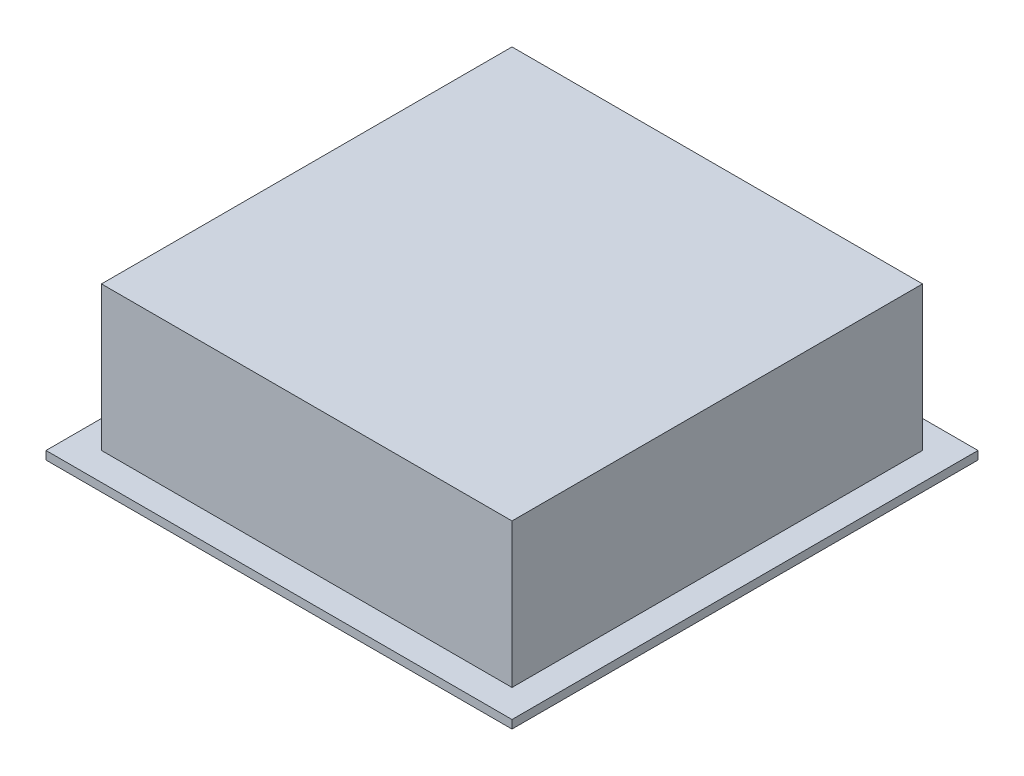
ISO-10303-21;
HEADER;
FILE_DESCRIPTION(('STEP AP214'),'2;1');
FILE_NAME('part.step','',(''),(''),'','','');
FILE_SCHEMA(('AUTOMOTIVE_DESIGN { 1 0 10303 214 1 1 1 1 }'));
ENDSEC;
DATA;
#1=APPLICATION_CONTEXT('core data for automotive mechanical design processes');
#2=APPLICATION_PROTOCOL_DEFINITION('international standard','automotive_design',2000,#1);
#3=PRODUCT_CONTEXT('',#1,'mechanical');
#4=PRODUCT('Part','Part','',(#3));
#5=PRODUCT_RELATED_PRODUCT_CATEGORY('part','',(#4));
#6=PRODUCT_DEFINITION_FORMATION('','',#4);
#7=PRODUCT_DEFINITION_CONTEXT('part definition',#1,'design');
#8=PRODUCT_DEFINITION('design','',#6,#7);
#9=PRODUCT_DEFINITION_SHAPE('','',#8);
#10=(LENGTH_UNIT() NAMED_UNIT(*) SI_UNIT(.MILLI.,.METRE.));
#11=(NAMED_UNIT(*) PLANE_ANGLE_UNIT() SI_UNIT($,.RADIAN.));
#12=(NAMED_UNIT(*) SI_UNIT($,.STERADIAN.) SOLID_ANGLE_UNIT());
#13=UNCERTAINTY_MEASURE_WITH_UNIT(LENGTH_MEASURE(1.E-05),#10,'distance_accuracy_value','');
#14=(GEOMETRIC_REPRESENTATION_CONTEXT(3) GLOBAL_UNCERTAINTY_ASSIGNED_CONTEXT((#13)) GLOBAL_UNIT_ASSIGNED_CONTEXT((#10,
#11,#12)) REPRESENTATION_CONTEXT('',''));
#15=CARTESIAN_POINT('',(0.,0.,0.));
#16=DIRECTION('',(0.,0.,1.));
#17=DIRECTION('',(1.,0.,0.));
#18=AXIS2_PLACEMENT_3D('',#15,#16,#17);
#19=CARTESIAN_POINT('',(0.,0.,0.));
#20=DIRECTION('',(0.,1.,0.));
#21=DIRECTION('',(0.,0.,1.));
#22=AXIS2_PLACEMENT_3D('',#19,#20,#21);
#23=PLANE('',#22);
#24=DIRECTION('',(0.,0.,1.));
#25=VECTOR('',#24,1.);
#26=CARTESIAN_POINT('',(-40.1772151898734,0.,-31.8227848101265));
#27=LINE('',#26,#25);
#28=CARTESIAN_POINT('',(-40.1772151898734,0.,-31.8227848101265));
#29=VERTEX_POINT('',#28);
#30=CARTESIAN_POINT('',(-40.1772151898734,0.,52.1772151898735));
#31=VERTEX_POINT('',#30);
#32=EDGE_CURVE('E203',#29,#31,#27,.T.);
#33=ORIENTED_EDGE('',*,*,#32,.F.);
#34=DIRECTION('',(-1.,0.,0.));
#35=VECTOR('',#34,1.);
#36=CARTESIAN_POINT('',(-40.1772151898734,0.,-31.8227848101265));
#37=LINE('',#36,#35);
#38=CARTESIAN_POINT('',(43.8227848101266,0.,-31.8227848101265));
#39=VERTEX_POINT('',#38);
#40=EDGE_CURVE('E209',#39,#29,#37,.T.);
#41=ORIENTED_EDGE('',*,*,#40,.F.);
#42=DIRECTION('',(0.,0.,-1.));
#43=VECTOR('',#42,1.);
#44=CARTESIAN_POINT('',(43.8227848101266,0.,-31.8227848101265));
#45=LINE('',#44,#43);
#46=CARTESIAN_POINT('',(43.8227848101266,0.,52.1772151898735));
#47=VERTEX_POINT('',#46);
#48=EDGE_CURVE('E225',#47,#39,#45,.T.);
#49=ORIENTED_EDGE('',*,*,#48,.F.);
#50=DIRECTION('',(1.,0.,0.));
#51=VECTOR('',#50,1.);
#52=CARTESIAN_POINT('',(-40.1772151898734,0.,52.1772151898735));
#53=LINE('',#52,#51);
#54=EDGE_CURVE('E222',#31,#47,#53,.T.);
#55=ORIENTED_EDGE('',*,*,#54,.F.);
#56=EDGE_LOOP('',(#33,#41,#49,#55));
#57=FACE_BOUND('',#56,.T.);
#58=DIRECTION('',(0.,0.,-1.));
#59=VECTOR('',#58,1.);
#60=CARTESIAN_POINT('',(-35.1772151898734,0.,47.1772151898735));
#61=LINE('',#60,#59);
#62=CARTESIAN_POINT('',(-35.1772151898734,0.,47.1772151898735));
#63=VERTEX_POINT('',#62);
#64=CARTESIAN_POINT('',(-35.1772151898734,0.,-26.8227848101265));
#65=VERTEX_POINT('',#64);
#66=EDGE_CURVE('E55',#63,#65,#61,.T.);
#67=ORIENTED_EDGE('',*,*,#66,.F.);
#68=DIRECTION('',(-1.,0.,0.));
#69=VECTOR('',#68,1.);
#70=CARTESIAN_POINT('',(-35.1772151898734,0.,47.1772151898735));
#71=LINE('',#70,#69);
#72=CARTESIAN_POINT('',(38.8227848101266,0.,47.1772151898735));
#73=VERTEX_POINT('',#72);
#74=EDGE_CURVE('E59',#73,#63,#71,.T.);
#75=ORIENTED_EDGE('',*,*,#74,.F.);
#76=DIRECTION('',(0.,0.,1.));
#77=VECTOR('',#76,1.);
#78=CARTESIAN_POINT('',(38.8227848101266,0.,47.1772151898735));
#79=LINE('',#78,#77);
#80=CARTESIAN_POINT('',(38.8227848101266,0.,-26.8227848101265));
#81=VERTEX_POINT('',#80);
#82=EDGE_CURVE('E410',#81,#73,#79,.T.);
#83=ORIENTED_EDGE('',*,*,#82,.F.);
#84=DIRECTION('',(1.,0.,0.));
#85=VECTOR('',#84,1.);
#86=CARTESIAN_POINT('',(-35.1772151898734,0.,-26.8227848101265));
#87=LINE('',#86,#85);
#88=EDGE_CURVE('E420',#65,#81,#87,.T.);
#89=ORIENTED_EDGE('',*,*,#88,.F.);
#90=EDGE_LOOP('',(#67,#75,#83,#89));
#91=FACE_BOUND('',#90,.T.);
#92=ADVANCED_FACE('F39',(#57,#91),#23,.F.);
#93=CARTESIAN_POINT('',(-40.1772151898734,1.5,-31.8227848101265));
#94=DIRECTION('',(1.,0.,0.));
#95=DIRECTION('',(0.,0.,-1.));
#96=AXIS2_PLACEMENT_3D('',#93,#94,#95);
#97=PLANE('',#96);
#98=ORIENTED_EDGE('',*,*,#32,.T.);
#99=DIRECTION('',(0.,-1.,0.));
#100=VECTOR('',#99,1.);
#101=CARTESIAN_POINT('',(-40.1772151898734,1.5,52.1772151898735));
#102=LINE('',#101,#100);
#103=CARTESIAN_POINT('',(-40.1772151898734,1.5,52.1772151898735));
#104=VERTEX_POINT('',#103);
#105=EDGE_CURVE('E11',#104,#31,#102,.T.);
#106=ORIENTED_EDGE('',*,*,#105,.F.);
#107=DIRECTION('',(0.,0.,1.));
#108=VECTOR('',#107,1.);
#109=CARTESIAN_POINT('',(-40.1772151898734,1.5,-31.8227848101265));
#110=LINE('',#109,#108);
#111=CARTESIAN_POINT('',(-40.1772151898734,1.5,-31.8227848101265));
#112=VERTEX_POINT('',#111);
#113=EDGE_CURVE('E204',#112,#104,#110,.T.);
#114=ORIENTED_EDGE('',*,*,#113,.F.);
#115=DIRECTION('',(0.,-1.,0.));
#116=VECTOR('',#115,1.);
#117=CARTESIAN_POINT('',(-40.1772151898734,1.5,-31.8227848101265));
#118=LINE('',#117,#116);
#119=EDGE_CURVE('E218',#112,#29,#118,.T.);
#120=ORIENTED_EDGE('',*,*,#119,.T.);
#121=EDGE_LOOP('',(#98,#106,#114,#120));
#122=FACE_BOUND('',#121,.T.);
#123=ADVANCED_FACE('F41',(#122),#97,.F.);
#124=CARTESIAN_POINT('',(-40.1772151898734,1.5,52.1772151898735));
#125=DIRECTION('',(0.,0.,-1.));
#126=DIRECTION('',(-1.,0.,0.));
#127=AXIS2_PLACEMENT_3D('',#124,#125,#126);
#128=PLANE('',#127);
#129=ORIENTED_EDGE('',*,*,#54,.T.);
#130=DIRECTION('',(0.,-1.,0.));
#131=VECTOR('',#130,1.);
#132=CARTESIAN_POINT('',(43.8227848101266,1.5,52.1772151898735));
#133=LINE('',#132,#131);
#134=CARTESIAN_POINT('',(43.8227848101266,1.5,52.1772151898735));
#135=VERTEX_POINT('',#134);
#136=EDGE_CURVE('E48',#135,#47,#133,.T.);
#137=ORIENTED_EDGE('',*,*,#136,.F.);
#138=DIRECTION('',(1.,0.,0.));
#139=VECTOR('',#138,1.);
#140=CARTESIAN_POINT('',(-40.1772151898734,1.5,52.1772151898735));
#141=LINE('',#140,#139);
#142=EDGE_CURVE('E208',#104,#135,#141,.T.);
#143=ORIENTED_EDGE('',*,*,#142,.F.);
#144=ORIENTED_EDGE('',*,*,#105,.T.);
#145=EDGE_LOOP('',(#129,#137,#143,#144));
#146=FACE_BOUND('',#145,.T.);
#147=ADVANCED_FACE('F257',(#146),#128,.F.);
#148=CARTESIAN_POINT('',(43.8227848101266,1.5,-31.8227848101265));
#149=DIRECTION('',(-1.,0.,0.));
#150=DIRECTION('',(0.,0.,1.));
#151=AXIS2_PLACEMENT_3D('',#148,#149,#150);
#152=PLANE('',#151);
#153=ORIENTED_EDGE('',*,*,#48,.T.);
#154=DIRECTION('',(0.,-1.,0.));
#155=VECTOR('',#154,1.);
#156=CARTESIAN_POINT('',(43.8227848101266,1.5,-31.8227848101265));
#157=LINE('',#156,#155);
#158=CARTESIAN_POINT('',(43.8227848101266,1.5,-31.8227848101265));
#159=VERTEX_POINT('',#158);
#160=EDGE_CURVE('E233',#159,#39,#157,.T.);
#161=ORIENTED_EDGE('',*,*,#160,.F.);
#162=DIRECTION('',(0.,0.,-1.));
#163=VECTOR('',#162,1.);
#164=CARTESIAN_POINT('',(43.8227848101266,1.5,-31.8227848101265));
#165=LINE('',#164,#163);
#166=EDGE_CURVE('E212',#135,#159,#165,.T.);
#167=ORIENTED_EDGE('',*,*,#166,.F.);
#168=ORIENTED_EDGE('',*,*,#136,.T.);
#169=EDGE_LOOP('',(#153,#161,#167,#168));
#170=FACE_BOUND('',#169,.T.);
#171=ADVANCED_FACE('F242',(#170),#152,.F.);
#172=CARTESIAN_POINT('',(-40.1772151898734,1.5,-31.8227848101265));
#173=DIRECTION('',(0.,0.,1.));
#174=DIRECTION('',(1.,0.,0.));
#175=AXIS2_PLACEMENT_3D('',#172,#173,#174);
#176=PLANE('',#175);
#177=ORIENTED_EDGE('',*,*,#40,.T.);
#178=ORIENTED_EDGE('',*,*,#119,.F.);
#179=DIRECTION('',(-1.,0.,0.));
#180=VECTOR('',#179,1.);
#181=CARTESIAN_POINT('',(-40.1772151898734,1.5,-31.8227848101265));
#182=LINE('',#181,#180);
#183=EDGE_CURVE('E215',#159,#112,#182,.T.);
#184=ORIENTED_EDGE('',*,*,#183,.F.);
#185=ORIENTED_EDGE('',*,*,#160,.T.);
#186=EDGE_LOOP('',(#177,#178,#184,#185));
#187=FACE_BOUND('',#186,.T.);
#188=ADVANCED_FACE('F250',(#187),#176,.F.);
#189=CARTESIAN_POINT('',(0.,1.5,0.));
#190=DIRECTION('',(0.,1.,0.));
#191=DIRECTION('',(0.,0.,1.));
#192=AXIS2_PLACEMENT_3D('',#189,#190,#191);
#193=PLANE('',#192);
#194=DIRECTION('',(0.,0.,1.));
#195=VECTOR('',#194,1.);
#196=CARTESIAN_POINT('',(-35.1772151898734,1.5,-26.8227848101265));
#197=LINE('',#196,#195);
#198=CARTESIAN_POINT('',(-35.1772151898734,1.5,-26.8227848101265));
#199=VERTEX_POINT('',#198);
#200=CARTESIAN_POINT('',(-35.1772151898734,1.5,47.1772151898735));
#201=VERTEX_POINT('',#200);
#202=EDGE_CURVE('E152',#199,#201,#197,.T.);
#203=ORIENTED_EDGE('',*,*,#202,.F.);
#204=DIRECTION('',(-1.,0.,0.));
#205=VECTOR('',#204,1.);
#206=CARTESIAN_POINT('',(-35.1772151898734,1.5,-26.8227848101265));
#207=LINE('',#206,#205);
#208=CARTESIAN_POINT('',(38.8227848101266,1.5,-26.8227848101265));
#209=VERTEX_POINT('',#208);
#210=EDGE_CURVE('E168',#209,#199,#207,.T.);
#211=ORIENTED_EDGE('',*,*,#210,.F.);
#212=DIRECTION('',(0.,0.,-1.));
#213=VECTOR('',#212,1.);
#214=CARTESIAN_POINT('',(38.8227848101266,1.5,-26.8227848101265));
#215=LINE('',#214,#213);
#216=CARTESIAN_POINT('',(38.8227848101266,1.5,47.1772151898735));
#217=VERTEX_POINT('',#216);
#218=EDGE_CURVE('E181',#217,#209,#215,.T.);
#219=ORIENTED_EDGE('',*,*,#218,.F.);
#220=DIRECTION('',(1.,0.,0.));
#221=VECTOR('',#220,1.);
#222=CARTESIAN_POINT('',(-35.1772151898734,1.5,47.1772151898735));
#223=LINE('',#222,#221);
#224=EDGE_CURVE('E157',#201,#217,#223,.T.);
#225=ORIENTED_EDGE('',*,*,#224,.F.);
#226=EDGE_LOOP('',(#203,#211,#219,#225));
#227=FACE_BOUND('',#226,.T.);
#228=ORIENTED_EDGE('',*,*,#113,.T.);
#229=ORIENTED_EDGE('',*,*,#142,.T.);
#230=ORIENTED_EDGE('',*,*,#166,.T.);
#231=ORIENTED_EDGE('',*,*,#183,.T.);
#232=EDGE_LOOP('',(#228,#229,#230,#231));
#233=FACE_BOUND('',#232,.T.);
#234=ADVANCED_FACE('F256',(#227,#233),#193,.T.);
#235=CARTESIAN_POINT('',(-35.1772151898734,27.5,-26.8227848101265));
#236=DIRECTION('',(1.,0.,0.));
#237=DIRECTION('',(0.,0.,-1.));
#238=AXIS2_PLACEMENT_3D('',#235,#236,#237);
#239=PLANE('',#238);
#240=ORIENTED_EDGE('',*,*,#202,.T.);
#241=DIRECTION('',(0.,-1.,0.));
#242=VECTOR('',#241,1.);
#243=CARTESIAN_POINT('',(-35.1772151898734,27.5,47.1772151898735));
#244=LINE('',#243,#242);
#245=CARTESIAN_POINT('',(-35.1772151898734,27.5,47.1772151898735));
#246=VERTEX_POINT('',#245);
#247=EDGE_CURVE('E199',#246,#201,#244,.T.);
#248=ORIENTED_EDGE('',*,*,#247,.F.);
#249=DIRECTION('',(0.,0.,1.));
#250=VECTOR('',#249,1.);
#251=CARTESIAN_POINT('',(-35.1772151898734,27.5,-26.8227848101265));
#252=LINE('',#251,#250);
#253=CARTESIAN_POINT('',(-35.1772151898734,27.5,-26.8227848101265));
#254=VERTEX_POINT('',#253);
#255=EDGE_CURVE('E163',#254,#246,#252,.T.);
#256=ORIENTED_EDGE('',*,*,#255,.F.);
#257=DIRECTION('',(0.,-1.,0.));
#258=VECTOR('',#257,1.);
#259=CARTESIAN_POINT('',(-35.1772151898734,27.5,-26.8227848101265));
#260=LINE('',#259,#258);
#261=EDGE_CURVE('E176',#254,#199,#260,.T.);
#262=ORIENTED_EDGE('',*,*,#261,.T.);
#263=EDGE_LOOP('',(#240,#248,#256,#262));
#264=FACE_BOUND('',#263,.T.);
#265=ADVANCED_FACE('F275',(#264),#239,.F.);
#266=CARTESIAN_POINT('',(-35.1772151898734,27.5,47.1772151898735));
#267=DIRECTION('',(0.,0.,-1.));
#268=DIRECTION('',(-1.,0.,0.));
#269=AXIS2_PLACEMENT_3D('',#266,#267,#268);
#270=PLANE('',#269);
#271=ORIENTED_EDGE('',*,*,#224,.T.);
#272=DIRECTION('',(0.,-1.,0.));
#273=VECTOR('',#272,1.);
#274=CARTESIAN_POINT('',(38.8227848101266,27.5,47.1772151898735));
#275=LINE('',#274,#273);
#276=CARTESIAN_POINT('',(38.8227848101266,27.5,47.1772151898735));
#277=VERTEX_POINT('',#276);
#278=EDGE_CURVE('E195',#277,#217,#275,.T.);
#279=ORIENTED_EDGE('',*,*,#278,.F.);
#280=DIRECTION('',(1.,0.,0.));
#281=VECTOR('',#280,1.);
#282=CARTESIAN_POINT('',(-35.1772151898734,27.5,47.1772151898735));
#283=LINE('',#282,#281);
#284=EDGE_CURVE('E167',#246,#277,#283,.T.);
#285=ORIENTED_EDGE('',*,*,#284,.F.);
#286=ORIENTED_EDGE('',*,*,#247,.T.);
#287=EDGE_LOOP('',(#271,#279,#285,#286));
#288=FACE_BOUND('',#287,.T.);
#289=ADVANCED_FACE('F280',(#288),#270,.F.);
#290=CARTESIAN_POINT('',(38.8227848101266,27.5,-26.8227848101265));
#291=DIRECTION('',(-1.,0.,0.));
#292=DIRECTION('',(0.,0.,1.));
#293=AXIS2_PLACEMENT_3D('',#290,#291,#292);
#294=PLANE('',#293);
#295=ORIENTED_EDGE('',*,*,#218,.T.);
#296=DIRECTION('',(0.,-1.,0.));
#297=VECTOR('',#296,1.);
#298=CARTESIAN_POINT('',(38.8227848101266,27.5,-26.8227848101265));
#299=LINE('',#298,#297);
#300=CARTESIAN_POINT('',(38.8227848101266,27.5,-26.8227848101265));
#301=VERTEX_POINT('',#300);
#302=EDGE_CURVE('E191',#301,#209,#299,.T.);
#303=ORIENTED_EDGE('',*,*,#302,.F.);
#304=DIRECTION('',(0.,0.,-1.));
#305=VECTOR('',#304,1.);
#306=CARTESIAN_POINT('',(38.8227848101266,27.5,-26.8227848101265));
#307=LINE('',#306,#305);
#308=EDGE_CURVE('E171',#277,#301,#307,.T.);
#309=ORIENTED_EDGE('',*,*,#308,.F.);
#310=ORIENTED_EDGE('',*,*,#278,.T.);
#311=EDGE_LOOP('',(#295,#303,#309,#310));
#312=FACE_BOUND('',#311,.T.);
#313=ADVANCED_FACE('F294',(#312),#294,.F.);
#314=CARTESIAN_POINT('',(-35.1772151898734,27.5,-26.8227848101265));
#315=DIRECTION('',(0.,0.,1.));
#316=DIRECTION('',(1.,0.,0.));
#317=AXIS2_PLACEMENT_3D('',#314,#315,#316);
#318=PLANE('',#317);
#319=ORIENTED_EDGE('',*,*,#210,.T.);
#320=ORIENTED_EDGE('',*,*,#261,.F.);
#321=DIRECTION('',(-1.,0.,0.));
#322=VECTOR('',#321,1.);
#323=CARTESIAN_POINT('',(-35.1772151898734,27.5,-26.8227848101265));
#324=LINE('',#323,#322);
#325=EDGE_CURVE('E174',#301,#254,#324,.T.);
#326=ORIENTED_EDGE('',*,*,#325,.F.);
#327=ORIENTED_EDGE('',*,*,#302,.T.);
#328=EDGE_LOOP('',(#319,#320,#326,#327));
#329=FACE_BOUND('',#328,.T.);
#330=ADVANCED_FACE('F285',(#329),#318,.F.);
#331=CARTESIAN_POINT('',(0.,27.5,0.));
#332=DIRECTION('',(0.,1.,0.));
#333=DIRECTION('',(0.,0.,1.));
#334=AXIS2_PLACEMENT_3D('',#331,#332,#333);
#335=PLANE('',#334);
#336=ORIENTED_EDGE('',*,*,#255,.T.);
#337=ORIENTED_EDGE('',*,*,#284,.T.);
#338=ORIENTED_EDGE('',*,*,#308,.T.);
#339=ORIENTED_EDGE('',*,*,#325,.T.);
#340=EDGE_LOOP('',(#336,#337,#338,#339));
#341=FACE_BOUND('',#340,.T.);
#342=ADVANCED_FACE('F290',(#341),#335,.T.);
#343=CARTESIAN_POINT('',(-35.1772151898734,-1.,47.1772151898735));
#344=DIRECTION('',(1.,0.,0.));
#345=DIRECTION('',(0.,0.,-1.));
#346=AXIS2_PLACEMENT_3D('',#343,#344,#345);
#347=PLANE('',#346);
#348=ORIENTED_EDGE('',*,*,#66,.T.);
#349=DIRECTION('',(0.,1.,0.));
#350=VECTOR('',#349,1.);
#351=CARTESIAN_POINT('',(-35.1772151898734,-1.,-26.8227848101265));
#352=LINE('',#351,#350);
#353=CARTESIAN_POINT('',(-35.1772151898734,-1.,-26.8227848101265));
#354=VERTEX_POINT('',#353);
#355=EDGE_CURVE('E132',#354,#65,#352,.T.);
#356=ORIENTED_EDGE('',*,*,#355,.F.);
#357=DIRECTION('',(0.,0.,-1.));
#358=VECTOR('',#357,1.);
#359=CARTESIAN_POINT('',(-35.1772151898734,-1.,47.1772151898735));
#360=LINE('',#359,#358);
#361=CARTESIAN_POINT('',(-35.1772151898734,-1.,47.1772151898735));
#362=VERTEX_POINT('',#361);
#363=EDGE_CURVE('E139',#362,#354,#360,.T.);
#364=ORIENTED_EDGE('',*,*,#363,.F.);
#365=DIRECTION('',(0.,1.,0.));
#366=VECTOR('',#365,1.);
#367=CARTESIAN_POINT('',(-35.1772151898734,-1.,47.1772151898735));
#368=LINE('',#367,#366);
#369=EDGE_CURVE('E407',#362,#63,#368,.T.);
#370=ORIENTED_EDGE('',*,*,#369,.T.);
#371=EDGE_LOOP('',(#348,#356,#364,#370));
#372=FACE_BOUND('',#371,.T.);
#373=ADVANCED_FACE('F150',(#372),#347,.F.);
#374=CARTESIAN_POINT('',(-35.1772151898734,-1.,-26.8227848101265));
#375=DIRECTION('',(0.,0.,1.));
#376=DIRECTION('',(1.,0.,0.));
#377=AXIS2_PLACEMENT_3D('',#374,#375,#376);
#378=PLANE('',#377);
#379=ORIENTED_EDGE('',*,*,#88,.T.);
#380=DIRECTION('',(0.,1.,0.));
#381=VECTOR('',#380,1.);
#382=CARTESIAN_POINT('',(38.8227848101266,-1.,-26.8227848101265));
#383=LINE('',#382,#381);
#384=CARTESIAN_POINT('',(38.8227848101266,-1.,-26.8227848101265));
#385=VERTEX_POINT('',#384);
#386=EDGE_CURVE('E134',#385,#81,#383,.T.);
#387=ORIENTED_EDGE('',*,*,#386,.F.);
#388=DIRECTION('',(1.,0.,0.));
#389=VECTOR('',#388,1.);
#390=CARTESIAN_POINT('',(-35.1772151898734,-1.,-26.8227848101265));
#391=LINE('',#390,#389);
#392=EDGE_CURVE('E127',#354,#385,#391,.T.);
#393=ORIENTED_EDGE('',*,*,#392,.F.);
#394=ORIENTED_EDGE('',*,*,#355,.T.);
#395=EDGE_LOOP('',(#379,#387,#393,#394));
#396=FACE_BOUND('',#395,.T.);
#397=ADVANCED_FACE('F130',(#396),#378,.F.);
#398=CARTESIAN_POINT('',(38.8227848101266,-1.,47.1772151898735));
#399=DIRECTION('',(-1.,0.,0.));
#400=DIRECTION('',(0.,0.,1.));
#401=AXIS2_PLACEMENT_3D('',#398,#399,#400);
#402=PLANE('',#401);
#403=ORIENTED_EDGE('',*,*,#82,.T.);
#404=DIRECTION('',(0.,1.,0.));
#405=VECTOR('',#404,1.);
#406=CARTESIAN_POINT('',(38.8227848101266,-1.,47.1772151898735));
#407=LINE('',#406,#405);
#408=CARTESIAN_POINT('',(38.8227848101266,-1.,47.1772151898735));
#409=VERTEX_POINT('',#408);
#410=EDGE_CURVE('E159',#409,#73,#407,.T.);
#411=ORIENTED_EDGE('',*,*,#410,.F.);
#412=DIRECTION('',(0.,0.,1.));
#413=VECTOR('',#412,1.);
#414=CARTESIAN_POINT('',(38.8227848101266,-1.,47.1772151898735));
#415=LINE('',#414,#413);
#416=EDGE_CURVE('E138',#385,#409,#415,.T.);
#417=ORIENTED_EDGE('',*,*,#416,.F.);
#418=ORIENTED_EDGE('',*,*,#386,.T.);
#419=EDGE_LOOP('',(#403,#411,#417,#418));
#420=FACE_BOUND('',#419,.T.);
#421=ADVANCED_FACE('F311',(#420),#402,.F.);
#422=CARTESIAN_POINT('',(-35.1772151898734,-1.,47.1772151898735));
#423=DIRECTION('',(0.,0.,-1.));
#424=DIRECTION('',(-1.,0.,0.));
#425=AXIS2_PLACEMENT_3D('',#422,#423,#424);
#426=PLANE('',#425);
#427=ORIENTED_EDGE('',*,*,#74,.T.);
#428=ORIENTED_EDGE('',*,*,#369,.F.);
#429=DIRECTION('',(-1.,0.,0.));
#430=VECTOR('',#429,1.);
#431=CARTESIAN_POINT('',(-35.1772151898734,-1.,47.1772151898735));
#432=LINE('',#431,#430);
#433=EDGE_CURVE('E144',#409,#362,#432,.T.);
#434=ORIENTED_EDGE('',*,*,#433,.F.);
#435=ORIENTED_EDGE('',*,*,#410,.T.);
#436=EDGE_LOOP('',(#427,#428,#434,#435));
#437=FACE_BOUND('',#436,.T.);
#438=ADVANCED_FACE('F314',(#437),#426,.F.);
#439=CARTESIAN_POINT('',(0.,-1.,0.));
#440=DIRECTION('',(0.,-1.,0.));
#441=DIRECTION('',(0.,0.,-1.));
#442=AXIS2_PLACEMENT_3D('',#439,#440,#441);
#443=PLANE('',#442);
#444=ORIENTED_EDGE('',*,*,#363,.T.);
#445=ORIENTED_EDGE('',*,*,#392,.T.);
#446=ORIENTED_EDGE('',*,*,#416,.T.);
#447=ORIENTED_EDGE('',*,*,#433,.T.);
#448=EDGE_LOOP('',(#444,#445,#446,#447));
#449=FACE_BOUND('',#448,.T.);
#450=ADVANCED_FACE('F142',(#449),#443,.T.);
#451=CLOSED_SHELL('',(#92,#123,#147,#171,#188,#234,#265,#289,#313,#330,#342,#373,#397,#421,#438,#450));
#452=MANIFOLD_SOLID_BREP('B2',#451);
#453=ADVANCED_BREP_SHAPE_REPRESENTATION('',(#18,#452),#14);
#454=SHAPE_DEFINITION_REPRESENTATION(#9,#453);
ENDSEC;
END-ISO-10303-21;
